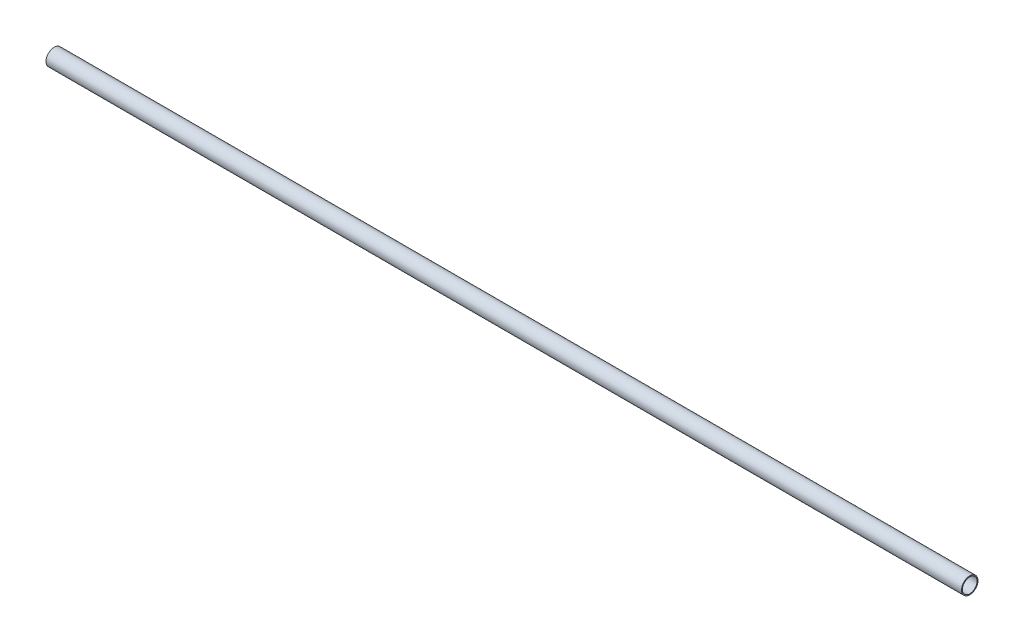
ISO-10303-21;
HEADER;
FILE_DESCRIPTION(('STEP AP214'),'2;1');
FILE_NAME('part.step','',(''),(''),'','','');
FILE_SCHEMA(('AUTOMOTIVE_DESIGN { 1 0 10303 214 1 1 1 1 }'));
ENDSEC;
DATA;
#1=APPLICATION_CONTEXT('core data for automotive mechanical design processes');
#2=APPLICATION_PROTOCOL_DEFINITION('international standard','automotive_design',2000,#1);
#3=PRODUCT_CONTEXT('',#1,'mechanical');
#4=PRODUCT('Part','Part','',(#3));
#5=PRODUCT_RELATED_PRODUCT_CATEGORY('part','',(#4));
#6=PRODUCT_DEFINITION_FORMATION('','',#4);
#7=PRODUCT_DEFINITION_CONTEXT('part definition',#1,'design');
#8=PRODUCT_DEFINITION('design','',#6,#7);
#9=PRODUCT_DEFINITION_SHAPE('','',#8);
#10=(LENGTH_UNIT() NAMED_UNIT(*) SI_UNIT(.MILLI.,.METRE.));
#11=(NAMED_UNIT(*) PLANE_ANGLE_UNIT() SI_UNIT($,.RADIAN.));
#12=(NAMED_UNIT(*) SI_UNIT($,.STERADIAN.) SOLID_ANGLE_UNIT());
#13=UNCERTAINTY_MEASURE_WITH_UNIT(LENGTH_MEASURE(1.E-05),#10,'distance_accuracy_value','');
#14=(GEOMETRIC_REPRESENTATION_CONTEXT(3) GLOBAL_UNCERTAINTY_ASSIGNED_CONTEXT((#13)) GLOBAL_UNIT_ASSIGNED_CONTEXT((#10,
#11,#12)) REPRESENTATION_CONTEXT('',''));
#15=CARTESIAN_POINT('',(0.,0.,0.));
#16=DIRECTION('',(0.,0.,1.));
#17=DIRECTION('',(1.,0.,0.));
#18=AXIS2_PLACEMENT_3D('',#15,#16,#17);
#19=CARTESIAN_POINT('',(500.,0.,0.));
#20=DIRECTION('',(1.,0.,0.));
#21=DIRECTION('',(0.,0.,-1.));
#22=AXIS2_PLACEMENT_3D('',#19,#20,#21);
#23=PLANE('',#22);
#24=CARTESIAN_POINT('',(500.,0.,0.));
#25=DIRECTION('',(1.,0.,0.));
#26=DIRECTION('',(0.,0.,-1.));
#27=AXIS2_PLACEMENT_3D('',#24,#25,#26);
#28=CIRCLE('',#27,9.);
#29=CARTESIAN_POINT('',(500.,0.,-9.));
#30=VERTEX_POINT('',#29);
#31=EDGE_CURVE('E10',#30,#30,#28,.T.);
#32=ORIENTED_EDGE('',*,*,#31,.T.);
#33=EDGE_LOOP('',(#32));
#34=FACE_BOUND('',#33,.T.);
#35=CARTESIAN_POINT('',(500.,0.,0.));
#36=DIRECTION('',(1.,0.,0.));
#37=DIRECTION('',(0.,0.,-1.));
#38=AXIS2_PLACEMENT_3D('',#35,#36,#37);
#39=CIRCLE('',#38,8.);
#40=CARTESIAN_POINT('',(500.,0.,-8.));
#41=VERTEX_POINT('',#40);
#42=EDGE_CURVE('E48',#41,#41,#39,.T.);
#43=ORIENTED_EDGE('',*,*,#42,.F.);
#44=EDGE_LOOP('',(#43));
#45=FACE_BOUND('',#44,.T.);
#46=ADVANCED_FACE('F40',(#34,#45),#23,.T.);
#47=CARTESIAN_POINT('',(-500.,0.,0.));
#48=DIRECTION('',(1.,0.,0.));
#49=DIRECTION('',(0.,0.,-1.));
#50=AXIS2_PLACEMENT_3D('',#47,#48,#49);
#51=PLANE('',#50);
#52=CARTESIAN_POINT('',(-500.,0.,0.));
#53=DIRECTION('',(1.,0.,0.));
#54=DIRECTION('',(0.,0.,-1.));
#55=AXIS2_PLACEMENT_3D('',#52,#53,#54);
#56=CIRCLE('',#55,9.);
#57=CARTESIAN_POINT('',(-500.,0.,-9.));
#58=VERTEX_POINT('',#57);
#59=EDGE_CURVE('E41',#58,#58,#56,.T.);
#60=ORIENTED_EDGE('',*,*,#59,.F.);
#61=EDGE_LOOP('',(#60));
#62=FACE_BOUND('',#61,.T.);
#63=CARTESIAN_POINT('',(-500.,0.,0.));
#64=DIRECTION('',(1.,0.,0.));
#65=DIRECTION('',(0.,0.,-1.));
#66=AXIS2_PLACEMENT_3D('',#63,#64,#65);
#67=CIRCLE('',#66,8.);
#68=CARTESIAN_POINT('',(-500.,0.,-8.));
#69=VERTEX_POINT('',#68);
#70=EDGE_CURVE('E49',#69,#69,#67,.T.);
#71=ORIENTED_EDGE('',*,*,#70,.T.);
#72=EDGE_LOOP('',(#71));
#73=FACE_BOUND('',#72,.T.);
#74=ADVANCED_FACE('F58',(#62,#73),#51,.F.);
#75=CARTESIAN_POINT('',(500.,0.,0.));
#76=DIRECTION('',(-1.,0.,0.));
#77=DIRECTION('',(0.,0.,1.));
#78=AXIS2_PLACEMENT_3D('',#75,#76,#77);
#79=CYLINDRICAL_SURFACE('',#78,9.);
#80=ORIENTED_EDGE('',*,*,#31,.F.);
#81=EDGE_LOOP('',(#80));
#82=FACE_BOUND('',#81,.T.);
#83=ORIENTED_EDGE('',*,*,#59,.T.);
#84=EDGE_LOOP('',(#83));
#85=FACE_BOUND('',#84,.T.);
#86=ADVANCED_FACE('F39',(#82,#85),#79,.T.);
#87=CARTESIAN_POINT('',(500.,0.,0.));
#88=DIRECTION('',(-1.,0.,0.));
#89=DIRECTION('',(0.,0.,1.));
#90=AXIS2_PLACEMENT_3D('',#87,#88,#89);
#91=CYLINDRICAL_SURFACE('',#90,8.);
#92=ORIENTED_EDGE('',*,*,#42,.T.);
#93=EDGE_LOOP('',(#92));
#94=FACE_BOUND('',#93,.T.);
#95=ORIENTED_EDGE('',*,*,#70,.F.);
#96=EDGE_LOOP('',(#95));
#97=FACE_BOUND('',#96,.T.);
#98=ADVANCED_FACE('F57',(#94,#97),#91,.F.);
#99=CLOSED_SHELL('',(#46,#74,#86,#98));
#100=MANIFOLD_SOLID_BREP('B2',#99);
#101=ADVANCED_BREP_SHAPE_REPRESENTATION('',(#18,#100),#14);
#102=SHAPE_DEFINITION_REPRESENTATION(#9,#101);
ENDSEC;
END-ISO-10303-21;
